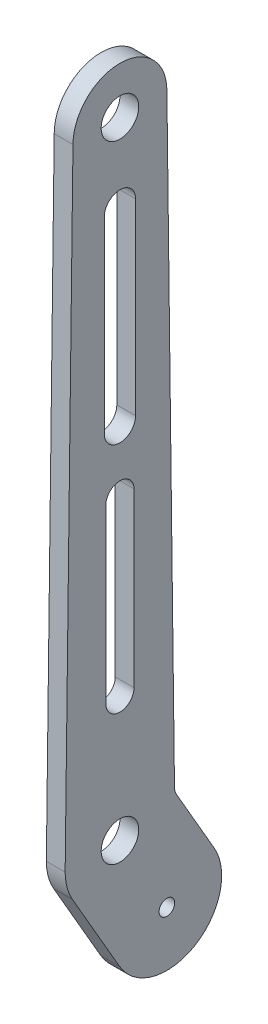
ISO-10303-21;
HEADER;
FILE_DESCRIPTION(('STEP AP214'),'2;1');
FILE_NAME('part.step','',(''),(''),'','','');
FILE_SCHEMA(('AUTOMOTIVE_DESIGN { 1 0 10303 214 1 1 1 1 }'));
ENDSEC;
DATA;
#1=APPLICATION_CONTEXT('core data for automotive mechanical design processes');
#2=APPLICATION_PROTOCOL_DEFINITION('international standard','automotive_design',2000,#1);
#3=PRODUCT_CONTEXT('',#1,'mechanical');
#4=PRODUCT('Part','Part','',(#3));
#5=PRODUCT_RELATED_PRODUCT_CATEGORY('part','',(#4));
#6=PRODUCT_DEFINITION_FORMATION('','',#4);
#7=PRODUCT_DEFINITION_CONTEXT('part definition',#1,'design');
#8=PRODUCT_DEFINITION('design','',#6,#7);
#9=PRODUCT_DEFINITION_SHAPE('','',#8);
#10=(LENGTH_UNIT() NAMED_UNIT(*) SI_UNIT(.MILLI.,.METRE.));
#11=(NAMED_UNIT(*) PLANE_ANGLE_UNIT() SI_UNIT($,.RADIAN.));
#12=(NAMED_UNIT(*) SI_UNIT($,.STERADIAN.) SOLID_ANGLE_UNIT());
#13=UNCERTAINTY_MEASURE_WITH_UNIT(LENGTH_MEASURE(1.E-05),#10,'distance_accuracy_value','');
#14=(GEOMETRIC_REPRESENTATION_CONTEXT(3) GLOBAL_UNCERTAINTY_ASSIGNED_CONTEXT((#13)) GLOBAL_UNIT_ASSIGNED_CONTEXT((#10,
#11,#12)) REPRESENTATION_CONTEXT('',''));
#15=CARTESIAN_POINT('',(0.,0.,0.));
#16=DIRECTION('',(0.,0.,1.));
#17=DIRECTION('',(1.,0.,0.));
#18=AXIS2_PLACEMENT_3D('',#15,#16,#17);
#19=CARTESIAN_POINT('',(6.,-200.,0.));
#20=DIRECTION('',(-1.,0.,0.));
#21=DIRECTION('',(0.,0.,1.));
#22=AXIS2_PLACEMENT_3D('',#19,#20,#21);
#23=CYLINDRICAL_SURFACE('',#22,17.5);
#24=DIRECTION('',(1.,0.,0.));
#25=VECTOR('',#24,1.);
#26=CARTESIAN_POINT('',(0.,-208.75,15.1554445662277));
#27=LINE('',#26,#25);
#28=CARTESIAN_POINT('',(0.,-208.75,15.1554445662277));
#29=VERTEX_POINT('',#28);
#30=CARTESIAN_POINT('',(6.,-208.75,15.1554445662277));
#31=VERTEX_POINT('',#30);
#32=EDGE_CURVE('E184',#29,#31,#27,.T.);
#33=ORIENTED_EDGE('',*,*,#32,.T.);
#34=CARTESIAN_POINT('',(6.,-200.,0.));
#35=DIRECTION('',(1.,0.,0.));
#36=DIRECTION('',(0.,0.,-1.));
#37=AXIS2_PLACEMENT_3D('',#34,#35,#36);
#38=CIRCLE('',#37,17.5);
#39=CARTESIAN_POINT('',(6.,-200.,17.5));
#40=VERTEX_POINT('',#39);
#41=EDGE_CURVE('E231',#40,#31,#38,.T.);
#42=ORIENTED_EDGE('',*,*,#41,.F.);
#43=DIRECTION('',(-1.,0.,0.));
#44=VECTOR('',#43,1.);
#45=CARTESIAN_POINT('',(6.,-200.,17.5));
#46=LINE('',#45,#44);
#47=CARTESIAN_POINT('',(0.,-200.,17.5));
#48=VERTEX_POINT('',#47);
#49=EDGE_CURVE('E354',#40,#48,#46,.T.);
#50=ORIENTED_EDGE('',*,*,#49,.T.);
#51=CARTESIAN_POINT('',(0.,-200.,0.));
#52=DIRECTION('',(1.,0.,0.));
#53=DIRECTION('',(0.,0.,-1.));
#54=AXIS2_PLACEMENT_3D('',#51,#52,#53);
#55=CIRCLE('',#54,17.5);
#56=EDGE_CURVE('E425',#48,#29,#55,.T.);
#57=ORIENTED_EDGE('',*,*,#56,.T.);
#58=EDGE_LOOP('',(#33,#42,#50,#57));
#59=FACE_BOUND('',#58,.T.);
#60=ADVANCED_FACE('F47',(#59),#23,.T.);
#61=CARTESIAN_POINT('',(6.,0.18747070770192,-14.9976566161537));
#62=DIRECTION('',(0.,0.0124990235519259,-0.999921884154081));
#63=DIRECTION('',(0.,0.999921884154082,0.0124990235519259));
#64=AXIS2_PLACEMENT_3D('',#61,#62,#63);
#65=PLANE('',#64);
#66=DIRECTION('',(0.,-0.999921884154082,-0.0124990235519259));
#67=VECTOR('',#66,1.);
#68=CARTESIAN_POINT('',(0.,0.18747070770192,-14.9976566161537));
#69=LINE('',#68,#67);
#70=CARTESIAN_POINT('',(0.,-199.562568348695,-17.4945321043587));
#71=VERTEX_POINT('',#70);
#72=CARTESIAN_POINT('',(0.,-200.,-17.5));
#73=VERTEX_POINT('',#72);
#74=EDGE_CURVE('E427',#71,#73,#69,.T.);
#75=ORIENTED_EDGE('',*,*,#74,.F.);
#76=DIRECTION('',(1.,0.,0.));
#77=VECTOR('',#76,1.);
#78=CARTESIAN_POINT('',(0.,-199.562568348695,-17.4945321043587));
#79=LINE('',#78,#77);
#80=CARTESIAN_POINT('',(6.,-199.562568348695,-17.4945321043587));
#81=VERTEX_POINT('',#80);
#82=EDGE_CURVE('E252',#71,#81,#79,.T.);
#83=ORIENTED_EDGE('',*,*,#82,.T.);
#84=DIRECTION('',(0.,-0.999921884154082,-0.0124990235519259));
#85=VECTOR('',#84,1.);
#86=CARTESIAN_POINT('',(6.,0.18747070770192,-14.9976566161537));
#87=LINE('',#86,#85);
#88=CARTESIAN_POINT('',(6.,-200.,-17.5));
#89=VERTEX_POINT('',#88);
#90=EDGE_CURVE('E230',#81,#89,#87,.T.);
#91=ORIENTED_EDGE('',*,*,#90,.T.);
#92=DIRECTION('',(-1.,0.,0.));
#93=VECTOR('',#92,1.);
#94=CARTESIAN_POINT('',(6.,-200.,-17.5));
#95=LINE('',#94,#93);
#96=EDGE_CURVE('E347',#89,#73,#95,.T.);
#97=ORIENTED_EDGE('',*,*,#96,.T.);
#98=EDGE_LOOP('',(#75,#83,#91,#97));
#99=FACE_BOUND('',#98,.T.);
#100=ADVANCED_FACE('F346',(#99),#65,.T.);
#101=CARTESIAN_POINT('',(6.,0.,-15.));
#102=VERTEX_POINT('',#101);
#103=CARTESIAN_POINT('',(6.,-193.900912670815,-17.4237614083852));
#104=VERTEX_POINT('',#103);
#105=EDGE_CURVE('E225',#102,#104,#87,.T.);
#106=ORIENTED_EDGE('',*,*,#105,.T.);
#107=DIRECTION('',(1.,0.,0.));
#108=VECTOR('',#107,1.);
#109=CARTESIAN_POINT('',(6.,-193.900912670815,-17.4237614083852));
#110=LINE('',#109,#108);
#111=CARTESIAN_POINT('',(0.,-193.900912670815,-17.4237614083852));
#112=VERTEX_POINT('',#111);
#113=EDGE_CURVE('E62',#104,#112,#110,.F.);
#114=ORIENTED_EDGE('',*,*,#113,.T.);
#115=CARTESIAN_POINT('',(0.,0.,-15.));
#116=VERTEX_POINT('',#115);
#117=EDGE_CURVE('E428',#116,#112,#69,.T.);
#118=ORIENTED_EDGE('',*,*,#117,.F.);
#119=DIRECTION('',(-1.,0.,0.));
#120=VECTOR('',#119,1.);
#121=CARTESIAN_POINT('',(6.,0.,-15.));
#122=LINE('',#121,#120);
#123=EDGE_CURVE('E355',#102,#116,#122,.T.);
#124=ORIENTED_EDGE('',*,*,#123,.F.);
#125=EDGE_LOOP('',(#106,#114,#118,#124));
#126=FACE_BOUND('',#125,.T.);
#127=ADVANCED_FACE('F396',(#126),#65,.T.);
#128=CARTESIAN_POINT('',(6.,0.18747070770192,14.9976566161537));
#129=DIRECTION('',(0.,0.0124990235519259,0.999921884154081));
#130=DIRECTION('',(0.,-0.999921884154082,0.0124990235519259));
#131=AXIS2_PLACEMENT_3D('',#128,#129,#130);
#132=PLANE('',#131);
#133=DIRECTION('',(0.,0.999921884154082,-0.0124990235519259));
#134=VECTOR('',#133,1.);
#135=CARTESIAN_POINT('',(0.,0.18747070770192,14.9976566161537));
#136=LINE('',#135,#134);
#137=CARTESIAN_POINT('',(0.,0.,15.));
#138=VERTEX_POINT('',#137);
#139=EDGE_CURVE('E420',#48,#138,#136,.T.);
#140=ORIENTED_EDGE('',*,*,#139,.F.);
#141=ORIENTED_EDGE('',*,*,#49,.F.);
#142=DIRECTION('',(0.,0.999921884154082,-0.0124990235519259));
#143=VECTOR('',#142,1.);
#144=CARTESIAN_POINT('',(6.,0.18747070770192,14.9976566161537));
#145=LINE('',#144,#143);
#146=CARTESIAN_POINT('',(6.,0.,15.));
#147=VERTEX_POINT('',#146);
#148=EDGE_CURVE('E326',#40,#147,#145,.T.);
#149=ORIENTED_EDGE('',*,*,#148,.T.);
#150=DIRECTION('',(-1.,0.,0.));
#151=VECTOR('',#150,1.);
#152=CARTESIAN_POINT('',(6.,0.,15.));
#153=LINE('',#152,#151);
#154=EDGE_CURVE('E433',#147,#138,#153,.T.);
#155=ORIENTED_EDGE('',*,*,#154,.T.);
#156=EDGE_LOOP('',(#140,#141,#149,#155));
#157=FACE_BOUND('',#156,.T.);
#158=ADVANCED_FACE('F400',(#157),#132,.T.);
#159=CARTESIAN_POINT('',(6.,0.,0.));
#160=DIRECTION('',(-1.,0.,0.));
#161=DIRECTION('',(0.,0.,1.));
#162=AXIS2_PLACEMENT_3D('',#159,#160,#161);
#163=CYLINDRICAL_SURFACE('',#162,6.);
#164=CARTESIAN_POINT('',(6.,0.,0.));
#165=DIRECTION('',(1.,0.,0.));
#166=DIRECTION('',(0.,0.,-1.));
#167=AXIS2_PLACEMENT_3D('',#164,#165,#166);
#168=CIRCLE('',#167,6.);
#169=CARTESIAN_POINT('',(6.,0.,-6.));
#170=VERTEX_POINT('',#169);
#171=EDGE_CURVE('E322',#170,#170,#168,.T.);
#172=ORIENTED_EDGE('',*,*,#171,.T.);
#173=EDGE_LOOP('',(#172));
#174=FACE_BOUND('',#173,.T.);
#175=CARTESIAN_POINT('',(0.,0.,0.));
#176=DIRECTION('',(1.,0.,0.));
#177=DIRECTION('',(0.,0.,-1.));
#178=AXIS2_PLACEMENT_3D('',#175,#176,#177);
#179=CIRCLE('',#178,6.);
#180=CARTESIAN_POINT('',(0.,0.,-6.));
#181=VERTEX_POINT('',#180);
#182=EDGE_CURVE('E418',#181,#181,#179,.T.);
#183=ORIENTED_EDGE('',*,*,#182,.F.);
#184=EDGE_LOOP('',(#183));
#185=FACE_BOUND('',#184,.T.);
#186=ADVANCED_FACE('F403',(#174,#185),#163,.F.);
#187=CARTESIAN_POINT('',(6.,-200.,0.));
#188=DIRECTION('',(-1.,0.,0.));
#189=DIRECTION('',(0.,0.,1.));
#190=AXIS2_PLACEMENT_3D('',#187,#188,#189);
#191=CYLINDRICAL_SURFACE('',#190,6.);
#192=CARTESIAN_POINT('',(6.,-200.,0.));
#193=DIRECTION('',(1.,0.,0.));
#194=DIRECTION('',(0.,0.,-1.));
#195=AXIS2_PLACEMENT_3D('',#192,#193,#194);
#196=CIRCLE('',#195,6.);
#197=CARTESIAN_POINT('',(6.,-200.,-6.));
#198=VERTEX_POINT('',#197);
#199=EDGE_CURVE('E296',#198,#198,#196,.T.);
#200=ORIENTED_EDGE('',*,*,#199,.T.);
#201=EDGE_LOOP('',(#200));
#202=FACE_BOUND('',#201,.T.);
#203=CARTESIAN_POINT('',(0.,-200.,0.));
#204=DIRECTION('',(1.,0.,0.));
#205=DIRECTION('',(0.,0.,-1.));
#206=AXIS2_PLACEMENT_3D('',#203,#204,#205);
#207=CIRCLE('',#206,6.);
#208=CARTESIAN_POINT('',(0.,-200.,-6.));
#209=VERTEX_POINT('',#208);
#210=EDGE_CURVE('E416',#209,#209,#207,.T.);
#211=ORIENTED_EDGE('',*,*,#210,.F.);
#212=EDGE_LOOP('',(#211));
#213=FACE_BOUND('',#212,.T.);
#214=ADVANCED_FACE('F405',(#202,#213),#191,.F.);
#215=CARTESIAN_POINT('',(6.,0.,0.));
#216=DIRECTION('',(-1.,0.,0.));
#217=DIRECTION('',(0.,0.,1.));
#218=AXIS2_PLACEMENT_3D('',#215,#216,#217);
#219=CYLINDRICAL_SURFACE('',#218,15.);
#220=CARTESIAN_POINT('',(0.,0.,0.));
#221=DIRECTION('',(1.,0.,0.));
#222=DIRECTION('',(0.,0.,-1.));
#223=AXIS2_PLACEMENT_3D('',#220,#221,#222);
#224=CIRCLE('',#223,15.);
#225=EDGE_CURVE('E430',#116,#138,#224,.T.);
#226=ORIENTED_EDGE('',*,*,#225,.T.);
#227=ORIENTED_EDGE('',*,*,#154,.F.);
#228=CARTESIAN_POINT('',(6.,0.,0.));
#229=DIRECTION('',(1.,0.,0.));
#230=DIRECTION('',(0.,0.,-1.));
#231=AXIS2_PLACEMENT_3D('',#228,#229,#230);
#232=CIRCLE('',#231,15.);
#233=EDGE_CURVE('E229',#102,#147,#232,.T.);
#234=ORIENTED_EDGE('',*,*,#233,.F.);
#235=ORIENTED_EDGE('',*,*,#123,.T.);
#236=EDGE_LOOP('',(#226,#227,#234,#235));
#237=FACE_BOUND('',#236,.T.);
#238=ADVANCED_FACE('F360',(#237),#219,.T.);
#239=CARTESIAN_POINT('',(6.,0.,0.));
#240=DIRECTION('',(1.,0.,0.));
#241=DIRECTION('',(0.,0.,-1.));
#242=AXIS2_PLACEMENT_3D('',#239,#240,#241);
#243=PLANE('',#242);
#244=CARTESIAN_POINT('',(6.,-200.,0.));
#245=DIRECTION('',(1.,0.,0.));
#246=DIRECTION('',(0.,0.,-1.));
#247=AXIS2_PLACEMENT_3D('',#244,#245,#246);
#248=CIRCLE('',#247,17.5);
#249=EDGE_CURVE('E209',#89,#81,#248,.T.);
#250=ORIENTED_EDGE('',*,*,#249,.F.);
#251=ORIENTED_EDGE('',*,*,#90,.F.);
#252=EDGE_LOOP('',(#250,#251));
#253=FACE_BOUND('',#252,.T.);
#254=CARTESIAN_POINT('',(6.,-25.,0.));
#255=DIRECTION('',(1.,0.,0.));
#256=DIRECTION('',(0.,0.,-1.));
#257=AXIS2_PLACEMENT_3D('',#254,#255,#256);
#258=CIRCLE('',#257,5.);
#259=CARTESIAN_POINT('',(6.,-25.,-5.));
#260=VERTEX_POINT('',#259);
#261=CARTESIAN_POINT('',(6.,-25.,5.));
#262=VERTEX_POINT('',#261);
#263=EDGE_CURVE('E257',#260,#262,#258,.T.);
#264=ORIENTED_EDGE('',*,*,#263,.F.);
#265=DIRECTION('',(0.,1.,0.));
#266=VECTOR('',#265,1.);
#267=CARTESIAN_POINT('',(6.,-25.,-5.));
#268=LINE('',#267,#266);
#269=CARTESIAN_POINT('',(6.,-85.,-5.));
#270=VERTEX_POINT('',#269);
#271=EDGE_CURVE('E271',#270,#260,#268,.T.);
#272=ORIENTED_EDGE('',*,*,#271,.F.);
#273=CARTESIAN_POINT('',(6.,-85.,0.));
#274=DIRECTION('',(1.,0.,0.));
#275=DIRECTION('',(0.,0.,-1.));
#276=AXIS2_PLACEMENT_3D('',#273,#274,#275);
#277=CIRCLE('',#276,4.99999999999999);
#278=CARTESIAN_POINT('',(6.,-85.,4.99999999999999));
#279=VERTEX_POINT('',#278);
#280=EDGE_CURVE('E277',#279,#270,#277,.T.);
#281=ORIENTED_EDGE('',*,*,#280,.F.);
#282=DIRECTION('',(0.,-1.,0.));
#283=VECTOR('',#282,1.);
#284=CARTESIAN_POINT('',(6.,-25.,5.));
#285=LINE('',#284,#283);
#286=EDGE_CURVE('E261',#262,#279,#285,.T.);
#287=ORIENTED_EDGE('',*,*,#286,.F.);
#288=EDGE_LOOP('',(#264,#272,#281,#287));
#289=FACE_BOUND('',#288,.T.);
#290=CARTESIAN_POINT('',(6.,-105.,0.));
#291=DIRECTION('',(1.,0.,0.));
#292=DIRECTION('',(0.,0.,-1.));
#293=AXIS2_PLACEMENT_3D('',#290,#291,#292);
#294=CIRCLE('',#293,4.5);
#295=CARTESIAN_POINT('',(6.,-105.,-4.50000000000001));
#296=VERTEX_POINT('',#295);
#297=CARTESIAN_POINT('',(6.,-105.,4.49999999999999));
#298=VERTEX_POINT('',#297);
#299=EDGE_CURVE('E262',#296,#298,#294,.T.);
#300=ORIENTED_EDGE('',*,*,#299,.F.);
#301=DIRECTION('',(0.,1.,0.));
#302=VECTOR('',#301,1.);
#303=CARTESIAN_POINT('',(6.,-105.,-4.50000000000001));
#304=LINE('',#303,#302);
#305=CARTESIAN_POINT('',(6.,-160.,-4.5));
#306=VERTEX_POINT('',#305);
#307=EDGE_CURVE('E304',#306,#296,#304,.T.);
#308=ORIENTED_EDGE('',*,*,#307,.F.);
#309=CARTESIAN_POINT('',(6.,-160.,0.));
#310=DIRECTION('',(1.,0.,0.));
#311=DIRECTION('',(0.,0.,-1.));
#312=AXIS2_PLACEMENT_3D('',#309,#310,#311);
#313=CIRCLE('',#312,4.49999999999999);
#314=CARTESIAN_POINT('',(6.,-160.,4.49999999999998));
#315=VERTEX_POINT('',#314);
#316=EDGE_CURVE('E309',#315,#306,#313,.T.);
#317=ORIENTED_EDGE('',*,*,#316,.F.);
#318=DIRECTION('',(0.,-1.,0.));
#319=VECTOR('',#318,1.);
#320=CARTESIAN_POINT('',(6.,-105.,4.49999999999999));
#321=LINE('',#320,#319);
#322=EDGE_CURVE('E293',#298,#315,#321,.T.);
#323=ORIENTED_EDGE('',*,*,#322,.F.);
#324=EDGE_LOOP('',(#300,#308,#317,#323));
#325=FACE_BOUND('',#324,.T.);
#326=ORIENTED_EDGE('',*,*,#199,.F.);
#327=EDGE_LOOP('',(#326));
#328=FACE_BOUND('',#327,.T.);
#329=ORIENTED_EDGE('',*,*,#171,.F.);
#330=EDGE_LOOP('',(#329));
#331=FACE_BOUND('',#330,.T.);
#332=ORIENTED_EDGE('',*,*,#148,.F.);
#333=ORIENTED_EDGE('',*,*,#41,.T.);
#334=DIRECTION('',(0.,-0.866025403784438,-0.5));
#335=VECTOR('',#334,1.);
#336=CARTESIAN_POINT('',(6.,-58.7500000000001,101.757984944672));
#337=LINE('',#336,#335);
#338=CARTESIAN_POINT('',(6.,-234.730762113533,0.155444566227628));
#339=VERTEX_POINT('',#338);
#340=EDGE_CURVE('E213',#31,#339,#337,.T.);
#341=ORIENTED_EDGE('',*,*,#340,.T.);
#342=CARTESIAN_POINT('',(6.,-225.980762113533,-15.0000000000001));
#343=DIRECTION('',(1.,0.,0.));
#344=DIRECTION('',(0.,0.,-1.));
#345=AXIS2_PLACEMENT_3D('',#342,#343,#344);
#346=CIRCLE('',#345,17.5);
#347=CARTESIAN_POINT('',(6.,-217.230762113533,-30.1554445662277));
#348=VERTEX_POINT('',#347);
#349=EDGE_CURVE('E178',#339,#348,#346,.T.);
#350=ORIENTED_EDGE('',*,*,#349,.T.);
#351=DIRECTION('',(0.,-0.866025403784438,-0.500000000000002));
#352=VECTOR('',#351,1.);
#353=CARTESIAN_POINT('',(6.,-41.2500000000004,71.4470958122165));
#354=LINE('',#353,#352);
#355=CARTESIAN_POINT('',(6.,-196.338417553055,-18.0932438102334));
#356=VERTEX_POINT('',#355);
#357=EDGE_CURVE('E244',#356,#348,#354,.T.);
#358=ORIENTED_EDGE('',*,*,#357,.F.);
#359=CARTESIAN_POINT('',(6.,-193.838417553055,-22.4233708291556));
#360=DIRECTION('',(1.,0.,0.));
#361=DIRECTION('',(0.,0.,-1.));
#362=AXIS2_PLACEMENT_3D('',#359,#360,#361);
#363=CIRCLE('',#362,5.);
#364=EDGE_CURVE('E55',#356,#104,#363,.F.);
#365=ORIENTED_EDGE('',*,*,#364,.T.);
#366=ORIENTED_EDGE('',*,*,#105,.F.);
#367=ORIENTED_EDGE('',*,*,#233,.T.);
#368=EDGE_LOOP('',(#332,#333,#341,#350,#358,#365,#366,#367));
#369=FACE_BOUND('',#368,.T.);
#370=CARTESIAN_POINT('',(6.,-225.980762113533,-15.0000000000001));
#371=DIRECTION('',(1.,0.,0.));
#372=DIRECTION('',(0.,0.,-1.));
#373=AXIS2_PLACEMENT_3D('',#370,#371,#372);
#374=CIRCLE('',#373,2.49999999999999);
#375=CARTESIAN_POINT('',(6.,-225.980762113533,-17.5));
#376=VERTEX_POINT('',#375);
#377=EDGE_CURVE('E202',#376,#376,#374,.T.);
#378=ORIENTED_EDGE('',*,*,#377,.F.);
#379=EDGE_LOOP('',(#378));
#380=FACE_BOUND('',#379,.T.);
#381=ADVANCED_FACE('F357',(#253,#289,#325,#328,#331,#369,#380),#243,.T.);
#382=CARTESIAN_POINT('',(0.,0.,0.));
#383=DIRECTION('',(1.,0.,0.));
#384=DIRECTION('',(0.,0.,-1.));
#385=AXIS2_PLACEMENT_3D('',#382,#383,#384);
#386=PLANE('',#385);
#387=ORIENTED_EDGE('',*,*,#74,.T.);
#388=CARTESIAN_POINT('',(0.,-200.,0.));
#389=DIRECTION('',(1.,0.,0.));
#390=DIRECTION('',(0.,0.,-1.));
#391=AXIS2_PLACEMENT_3D('',#388,#389,#390);
#392=CIRCLE('',#391,17.5);
#393=EDGE_CURVE('E199',#73,#71,#392,.T.);
#394=ORIENTED_EDGE('',*,*,#393,.T.);
#395=EDGE_LOOP('',(#387,#394));
#396=FACE_BOUND('',#395,.T.);
#397=DIRECTION('',(0.,1.,0.));
#398=VECTOR('',#397,1.);
#399=CARTESIAN_POINT('',(0.,0.,-5.));
#400=LINE('',#399,#398);
#401=CARTESIAN_POINT('',(0.,-85.,-5.));
#402=VERTEX_POINT('',#401);
#403=CARTESIAN_POINT('',(0.,-25.,-5.));
#404=VERTEX_POINT('',#403);
#405=EDGE_CURVE('E455',#402,#404,#400,.T.);
#406=ORIENTED_EDGE('',*,*,#405,.T.);
#407=CARTESIAN_POINT('',(0.,-25.,0.));
#408=DIRECTION('',(1.,0.,0.));
#409=DIRECTION('',(0.,0.,-1.));
#410=AXIS2_PLACEMENT_3D('',#407,#408,#409);
#411=CIRCLE('',#410,5.);
#412=CARTESIAN_POINT('',(0.,-25.,5.));
#413=VERTEX_POINT('',#412);
#414=EDGE_CURVE('E458',#404,#413,#411,.T.);
#415=ORIENTED_EDGE('',*,*,#414,.T.);
#416=DIRECTION('',(0.,-1.,0.));
#417=VECTOR('',#416,1.);
#418=CARTESIAN_POINT('',(0.,0.,5.00000000000001));
#419=LINE('',#418,#417);
#420=CARTESIAN_POINT('',(0.,-85.,4.99999999999999));
#421=VERTEX_POINT('',#420);
#422=EDGE_CURVE('E449',#413,#421,#419,.T.);
#423=ORIENTED_EDGE('',*,*,#422,.T.);
#424=CARTESIAN_POINT('',(0.,-85.,0.));
#425=DIRECTION('',(1.,0.,0.));
#426=DIRECTION('',(0.,0.,-1.));
#427=AXIS2_PLACEMENT_3D('',#424,#425,#426);
#428=CIRCLE('',#427,4.99999999999999);
#429=EDGE_CURVE('E452',#421,#402,#428,.T.);
#430=ORIENTED_EDGE('',*,*,#429,.T.);
#431=EDGE_LOOP('',(#406,#415,#423,#430));
#432=FACE_BOUND('',#431,.T.);
#433=DIRECTION('',(0.,1.,0.));
#434=VECTOR('',#433,1.);
#435=CARTESIAN_POINT('',(0.,0.,-4.50000000000002));
#436=LINE('',#435,#434);
#437=CARTESIAN_POINT('',(0.,-160.,-4.5));
#438=VERTEX_POINT('',#437);
#439=CARTESIAN_POINT('',(0.,-105.,-4.50000000000001));
#440=VERTEX_POINT('',#439);
#441=EDGE_CURVE('E443',#438,#440,#436,.T.);
#442=ORIENTED_EDGE('',*,*,#441,.T.);
#443=CARTESIAN_POINT('',(0.,-105.,0.));
#444=DIRECTION('',(1.,0.,0.));
#445=DIRECTION('',(0.,0.,-1.));
#446=AXIS2_PLACEMENT_3D('',#443,#444,#445);
#447=CIRCLE('',#446,4.5);
#448=CARTESIAN_POINT('',(0.,-105.,4.49999999999999));
#449=VERTEX_POINT('',#448);
#450=EDGE_CURVE('E446',#440,#449,#447,.T.);
#451=ORIENTED_EDGE('',*,*,#450,.T.);
#452=DIRECTION('',(0.,-1.,0.));
#453=VECTOR('',#452,1.);
#454=CARTESIAN_POINT('',(0.,0.,4.50000000000003));
#455=LINE('',#454,#453);
#456=CARTESIAN_POINT('',(0.,-160.,4.49999999999997));
#457=VERTEX_POINT('',#456);
#458=EDGE_CURVE('E437',#449,#457,#455,.T.);
#459=ORIENTED_EDGE('',*,*,#458,.T.);
#460=CARTESIAN_POINT('',(0.,-160.,0.));
#461=DIRECTION('',(1.,0.,0.));
#462=DIRECTION('',(0.,0.,-1.));
#463=AXIS2_PLACEMENT_3D('',#460,#461,#462);
#464=CIRCLE('',#463,4.49999999999999);
#465=EDGE_CURVE('E440',#457,#438,#464,.T.);
#466=ORIENTED_EDGE('',*,*,#465,.T.);
#467=EDGE_LOOP('',(#442,#451,#459,#466));
#468=FACE_BOUND('',#467,.T.);
#469=ORIENTED_EDGE('',*,*,#210,.T.);
#470=EDGE_LOOP('',(#469));
#471=FACE_BOUND('',#470,.T.);
#472=ORIENTED_EDGE('',*,*,#182,.T.);
#473=EDGE_LOOP('',(#472));
#474=FACE_BOUND('',#473,.T.);
#475=ORIENTED_EDGE('',*,*,#139,.T.);
#476=ORIENTED_EDGE('',*,*,#225,.F.);
#477=ORIENTED_EDGE('',*,*,#117,.T.);
#478=CARTESIAN_POINT('',(0.,-193.838417553055,-22.4233708291556));
#479=DIRECTION('',(1.,0.,0.));
#480=DIRECTION('',(0.,0.,-1.));
#481=AXIS2_PLACEMENT_3D('',#478,#479,#480);
#482=CIRCLE('',#481,5.);
#483=CARTESIAN_POINT('',(0.,-196.338417553055,-18.0932438102334));
#484=VERTEX_POINT('',#483);
#485=EDGE_CURVE('E12',#112,#484,#482,.T.);
#486=ORIENTED_EDGE('',*,*,#485,.T.);
#487=DIRECTION('',(0.,-0.866025403784438,-0.500000000000002));
#488=VECTOR('',#487,1.);
#489=CARTESIAN_POINT('',(0.,-41.2500000000004,71.4470958122165));
#490=LINE('',#489,#488);
#491=CARTESIAN_POINT('',(0.,-217.230762113533,-30.1554445662277));
#492=VERTEX_POINT('',#491);
#493=EDGE_CURVE('E194',#484,#492,#490,.T.);
#494=ORIENTED_EDGE('',*,*,#493,.T.);
#495=CARTESIAN_POINT('',(0.,-225.980762113533,-15.0000000000001));
#496=DIRECTION('',(1.,0.,0.));
#497=DIRECTION('',(0.,0.,-1.));
#498=AXIS2_PLACEMENT_3D('',#495,#496,#497);
#499=CIRCLE('',#498,17.5);
#500=CARTESIAN_POINT('',(0.,-234.730762113533,0.155444566227628));
#501=VERTEX_POINT('',#500);
#502=EDGE_CURVE('E176',#501,#492,#499,.T.);
#503=ORIENTED_EDGE('',*,*,#502,.F.);
#504=DIRECTION('',(0.,-0.866025403784438,-0.5));
#505=VECTOR('',#504,1.);
#506=CARTESIAN_POINT('',(0.,-58.7500000000001,101.757984944672));
#507=LINE('',#506,#505);
#508=EDGE_CURVE('E192',#29,#501,#507,.T.);
#509=ORIENTED_EDGE('',*,*,#508,.F.);
#510=ORIENTED_EDGE('',*,*,#56,.F.);
#511=EDGE_LOOP('',(#475,#476,#477,#486,#494,#503,#509,#510));
#512=FACE_BOUND('',#511,.T.);
#513=CARTESIAN_POINT('',(0.,-225.980762113533,-15.0000000000001));
#514=DIRECTION('',(1.,0.,0.));
#515=DIRECTION('',(0.,0.,-1.));
#516=AXIS2_PLACEMENT_3D('',#513,#514,#515);
#517=CIRCLE('',#516,2.49999999999999);
#518=CARTESIAN_POINT('',(0.,-225.980762113533,-17.5));
#519=VERTEX_POINT('',#518);
#520=EDGE_CURVE('E206',#519,#519,#517,.T.);
#521=ORIENTED_EDGE('',*,*,#520,.T.);
#522=EDGE_LOOP('',(#521));
#523=FACE_BOUND('',#522,.T.);
#524=ADVANCED_FACE('F189',(#396,#432,#468,#471,#474,#512,#523),#386,.F.);
#525=CARTESIAN_POINT('',(-4.,-105.,0.));
#526=DIRECTION('',(1.,0.,0.));
#527=DIRECTION('',(0.,0.,-1.));
#528=AXIS2_PLACEMENT_3D('',#525,#526,#527);
#529=CYLINDRICAL_SURFACE('',#528,4.5);
#530=DIRECTION('',(1.,0.,0.));
#531=VECTOR('',#530,1.);
#532=CARTESIAN_POINT('',(-4.,-105.,-4.50000000000001));
#533=LINE('',#532,#531);
#534=EDGE_CURVE('E255',#440,#296,#533,.T.);
#535=ORIENTED_EDGE('',*,*,#534,.T.);
#536=ORIENTED_EDGE('',*,*,#299,.T.);
#537=DIRECTION('',(1.,0.,0.));
#538=VECTOR('',#537,1.);
#539=CARTESIAN_POINT('',(-4.,-105.,4.49999999999999));
#540=LINE('',#539,#538);
#541=EDGE_CURVE('E310',#449,#298,#540,.T.);
#542=ORIENTED_EDGE('',*,*,#541,.F.);
#543=ORIENTED_EDGE('',*,*,#450,.F.);
#544=EDGE_LOOP('',(#535,#536,#542,#543));
#545=FACE_BOUND('',#544,.T.);
#546=ADVANCED_FACE('F502',(#545),#529,.F.);
#547=CARTESIAN_POINT('',(-4.,-105.,-4.50000000000001));
#548=DIRECTION('',(0.,0.,-1.));
#549=DIRECTION('',(0.,1.,0.));
#550=AXIS2_PLACEMENT_3D('',#547,#548,#549);
#551=PLANE('',#550);
#552=DIRECTION('',(1.,0.,0.));
#553=VECTOR('',#552,1.);
#554=CARTESIAN_POINT('',(-4.,-160.,-4.5));
#555=LINE('',#554,#553);
#556=EDGE_CURVE('E528',#438,#306,#555,.T.);
#557=ORIENTED_EDGE('',*,*,#556,.T.);
#558=ORIENTED_EDGE('',*,*,#307,.T.);
#559=ORIENTED_EDGE('',*,*,#534,.F.);
#560=ORIENTED_EDGE('',*,*,#441,.F.);
#561=EDGE_LOOP('',(#557,#558,#559,#560));
#562=FACE_BOUND('',#561,.T.);
#563=ADVANCED_FACE('F505',(#562),#551,.F.);
#564=CARTESIAN_POINT('',(-4.,-160.,0.));
#565=DIRECTION('',(1.,0.,0.));
#566=DIRECTION('',(0.,0.,-1.));
#567=AXIS2_PLACEMENT_3D('',#564,#565,#566);
#568=CYLINDRICAL_SURFACE('',#567,4.49999999999999);
#569=DIRECTION('',(1.,0.,0.));
#570=VECTOR('',#569,1.);
#571=CARTESIAN_POINT('',(-4.,-160.,4.49999999999998));
#572=LINE('',#571,#570);
#573=EDGE_CURVE('E530',#457,#315,#572,.T.);
#574=ORIENTED_EDGE('',*,*,#573,.T.);
#575=ORIENTED_EDGE('',*,*,#316,.T.);
#576=ORIENTED_EDGE('',*,*,#556,.F.);
#577=ORIENTED_EDGE('',*,*,#465,.F.);
#578=EDGE_LOOP('',(#574,#575,#576,#577));
#579=FACE_BOUND('',#578,.T.);
#580=ADVANCED_FACE('F509',(#579),#568,.F.);
#581=CARTESIAN_POINT('',(-4.,-105.,4.49999999999999));
#582=DIRECTION('',(0.,0.,1.));
#583=DIRECTION('',(0.,-1.,0.));
#584=AXIS2_PLACEMENT_3D('',#581,#582,#583);
#585=PLANE('',#584);
#586=ORIENTED_EDGE('',*,*,#541,.T.);
#587=ORIENTED_EDGE('',*,*,#322,.T.);
#588=ORIENTED_EDGE('',*,*,#573,.F.);
#589=ORIENTED_EDGE('',*,*,#458,.F.);
#590=EDGE_LOOP('',(#586,#587,#588,#589));
#591=FACE_BOUND('',#590,.T.);
#592=ADVANCED_FACE('F500',(#591),#585,.F.);
#593=CARTESIAN_POINT('',(-4.,-25.,0.));
#594=DIRECTION('',(1.,0.,0.));
#595=DIRECTION('',(0.,0.,-1.));
#596=AXIS2_PLACEMENT_3D('',#593,#594,#595);
#597=CYLINDRICAL_SURFACE('',#596,5.);
#598=DIRECTION('',(1.,0.,0.));
#599=VECTOR('',#598,1.);
#600=CARTESIAN_POINT('',(-4.,-25.,-5.));
#601=LINE('',#600,#599);
#602=EDGE_CURVE('E279',#404,#260,#601,.T.);
#603=ORIENTED_EDGE('',*,*,#602,.T.);
#604=ORIENTED_EDGE('',*,*,#263,.T.);
#605=DIRECTION('',(1.,0.,0.));
#606=VECTOR('',#605,1.);
#607=CARTESIAN_POINT('',(-4.,-25.,5.));
#608=LINE('',#607,#606);
#609=EDGE_CURVE('E276',#413,#262,#608,.T.);
#610=ORIENTED_EDGE('',*,*,#609,.F.);
#611=ORIENTED_EDGE('',*,*,#414,.F.);
#612=EDGE_LOOP('',(#603,#604,#610,#611));
#613=FACE_BOUND('',#612,.T.);
#614=ADVANCED_FACE('F490',(#613),#597,.F.);
#615=CARTESIAN_POINT('',(-4.,-25.,-5.));
#616=DIRECTION('',(0.,0.,-1.));
#617=DIRECTION('',(-1.,0.,0.));
#618=AXIS2_PLACEMENT_3D('',#615,#616,#617);
#619=PLANE('',#618);
#620=DIRECTION('',(1.,0.,0.));
#621=VECTOR('',#620,1.);
#622=CARTESIAN_POINT('',(-4.,-85.,-5.));
#623=LINE('',#622,#621);
#624=EDGE_CURVE('E422',#402,#270,#623,.T.);
#625=ORIENTED_EDGE('',*,*,#624,.T.);
#626=ORIENTED_EDGE('',*,*,#271,.T.);
#627=ORIENTED_EDGE('',*,*,#602,.F.);
#628=ORIENTED_EDGE('',*,*,#405,.F.);
#629=EDGE_LOOP('',(#625,#626,#627,#628));
#630=FACE_BOUND('',#629,.T.);
#631=ADVANCED_FACE('F486',(#630),#619,.F.);
#632=CARTESIAN_POINT('',(-4.,-85.,0.));
#633=DIRECTION('',(1.,0.,0.));
#634=DIRECTION('',(0.,0.,-1.));
#635=AXIS2_PLACEMENT_3D('',#632,#633,#634);
#636=CYLINDRICAL_SURFACE('',#635,4.99999999999999);
#637=DIRECTION('',(1.,0.,0.));
#638=VECTOR('',#637,1.);
#639=CARTESIAN_POINT('',(-4.,-85.,4.99999999999999));
#640=LINE('',#639,#638);
#641=EDGE_CURVE('E537',#421,#279,#640,.T.);
#642=ORIENTED_EDGE('',*,*,#641,.T.);
#643=ORIENTED_EDGE('',*,*,#280,.T.);
#644=ORIENTED_EDGE('',*,*,#624,.F.);
#645=ORIENTED_EDGE('',*,*,#429,.F.);
#646=EDGE_LOOP('',(#642,#643,#644,#645));
#647=FACE_BOUND('',#646,.T.);
#648=ADVANCED_FACE('F489',(#647),#636,.F.);
#649=CARTESIAN_POINT('',(-4.,-25.,5.));
#650=DIRECTION('',(0.,0.,1.));
#651=DIRECTION('',(0.,-1.,0.));
#652=AXIS2_PLACEMENT_3D('',#649,#650,#651);
#653=PLANE('',#652);
#654=ORIENTED_EDGE('',*,*,#609,.T.);
#655=ORIENTED_EDGE('',*,*,#286,.T.);
#656=ORIENTED_EDGE('',*,*,#641,.F.);
#657=ORIENTED_EDGE('',*,*,#422,.F.);
#658=EDGE_LOOP('',(#654,#655,#656,#657));
#659=FACE_BOUND('',#658,.T.);
#660=ADVANCED_FACE('F483',(#659),#653,.F.);
#661=CARTESIAN_POINT('',(0.,-200.,0.));
#662=DIRECTION('',(1.,0.,0.));
#663=DIRECTION('',(0.,0.,-1.));
#664=AXIS2_PLACEMENT_3D('',#661,#662,#663);
#665=CYLINDRICAL_SURFACE('',#664,17.5);
#666=ORIENTED_EDGE('',*,*,#96,.F.);
#667=ORIENTED_EDGE('',*,*,#249,.T.);
#668=ORIENTED_EDGE('',*,*,#82,.F.);
#669=ORIENTED_EDGE('',*,*,#393,.F.);
#670=EDGE_LOOP('',(#666,#667,#668,#669));
#671=FACE_BOUND('',#670,.T.);
#672=ADVANCED_FACE('F353',(#671),#665,.F.);
#673=CARTESIAN_POINT('',(0.,-41.2500000000004,71.4470958122165));
#674=DIRECTION('',(0.,-0.500000000000002,0.866025403784437));
#675=DIRECTION('',(0.,-0.866025403784438,-0.500000000000002));
#676=AXIS2_PLACEMENT_3D('',#673,#674,#675);
#677=PLANE('',#676);
#678=ORIENTED_EDGE('',*,*,#493,.F.);
#679=DIRECTION('',(1.,0.,0.));
#680=VECTOR('',#679,1.);
#681=CARTESIAN_POINT('',(0.,-196.338417553055,-18.0932438102334));
#682=LINE('',#681,#680);
#683=EDGE_CURVE('E461',#484,#356,#682,.T.);
#684=ORIENTED_EDGE('',*,*,#683,.T.);
#685=ORIENTED_EDGE('',*,*,#357,.T.);
#686=DIRECTION('',(1.,0.,0.));
#687=VECTOR('',#686,1.);
#688=CARTESIAN_POINT('',(0.,-217.230762113533,-30.1554445662277));
#689=LINE('',#688,#687);
#690=EDGE_CURVE('E183',#492,#348,#689,.T.);
#691=ORIENTED_EDGE('',*,*,#690,.F.);
#692=EDGE_LOOP('',(#678,#684,#685,#691));
#693=FACE_BOUND('',#692,.T.);
#694=ADVANCED_FACE('F474',(#693),#677,.F.);
#695=CARTESIAN_POINT('',(0.,-225.980762113533,-15.0000000000001));
#696=DIRECTION('',(1.,0.,0.));
#697=DIRECTION('',(0.,0.,-1.));
#698=AXIS2_PLACEMENT_3D('',#695,#696,#697);
#699=CYLINDRICAL_SURFACE('',#698,17.5);
#700=ORIENTED_EDGE('',*,*,#349,.F.);
#701=DIRECTION('',(1.,0.,0.));
#702=VECTOR('',#701,1.);
#703=CARTESIAN_POINT('',(0.,-234.730762113533,0.155444566227628));
#704=LINE('',#703,#702);
#705=EDGE_CURVE('E172',#501,#339,#704,.T.);
#706=ORIENTED_EDGE('',*,*,#705,.F.);
#707=ORIENTED_EDGE('',*,*,#502,.T.);
#708=ORIENTED_EDGE('',*,*,#690,.T.);
#709=EDGE_LOOP('',(#700,#706,#707,#708));
#710=FACE_BOUND('',#709,.T.);
#711=ADVANCED_FACE('F174',(#710),#699,.T.);
#712=CARTESIAN_POINT('',(0.,-58.7500000000001,101.757984944672));
#713=DIRECTION('',(0.,-0.5,0.866025403784438));
#714=DIRECTION('',(0.,-0.866025403784438,-0.5));
#715=AXIS2_PLACEMENT_3D('',#712,#713,#714);
#716=PLANE('',#715);
#717=ORIENTED_EDGE('',*,*,#340,.F.);
#718=ORIENTED_EDGE('',*,*,#32,.F.);
#719=ORIENTED_EDGE('',*,*,#508,.T.);
#720=ORIENTED_EDGE('',*,*,#705,.T.);
#721=EDGE_LOOP('',(#717,#718,#719,#720));
#722=FACE_BOUND('',#721,.T.);
#723=ADVANCED_FACE('F198',(#722),#716,.T.);
#724=CARTESIAN_POINT('',(0.,-225.980762113533,-15.0000000000001));
#725=DIRECTION('',(1.,0.,0.));
#726=DIRECTION('',(0.,0.,-1.));
#727=AXIS2_PLACEMENT_3D('',#724,#725,#726);
#728=CYLINDRICAL_SURFACE('',#727,2.49999999999999);
#729=ORIENTED_EDGE('',*,*,#520,.F.);
#730=EDGE_LOOP('',(#729));
#731=FACE_BOUND('',#730,.T.);
#732=ORIENTED_EDGE('',*,*,#377,.T.);
#733=EDGE_LOOP('',(#732));
#734=FACE_BOUND('',#733,.T.);
#735=ADVANCED_FACE('F377',(#731,#734),#728,.F.);
#736=CARTESIAN_POINT('',(0.,-193.838417553055,-22.4233708291556));
#737=DIRECTION('',(1.,0.,0.));
#738=DIRECTION('',(0.,0.,-1.));
#739=AXIS2_PLACEMENT_3D('',#736,#737,#738);
#740=CYLINDRICAL_SURFACE('',#739,5.);
#741=ORIENTED_EDGE('',*,*,#485,.F.);
#742=ORIENTED_EDGE('',*,*,#113,.F.);
#743=ORIENTED_EDGE('',*,*,#364,.F.);
#744=ORIENTED_EDGE('',*,*,#683,.F.);
#745=EDGE_LOOP('',(#741,#742,#743,#744));
#746=FACE_BOUND('',#745,.T.);
#747=ADVANCED_FACE('F49',(#746),#740,.F.);
#748=CLOSED_SHELL('',(#60,#100,#127,#158,#186,#214,#238,#381,#524,#546,#563,#580,#592,#614,#631,
#648,#660,#672,#694,#711,#723,#735,#747));
#749=MANIFOLD_SOLID_BREP('B2',#748);
#750=ADVANCED_BREP_SHAPE_REPRESENTATION('',(#18,#749),#14);
#751=SHAPE_DEFINITION_REPRESENTATION(#9,#750);
ENDSEC;
END-ISO-10303-21;
